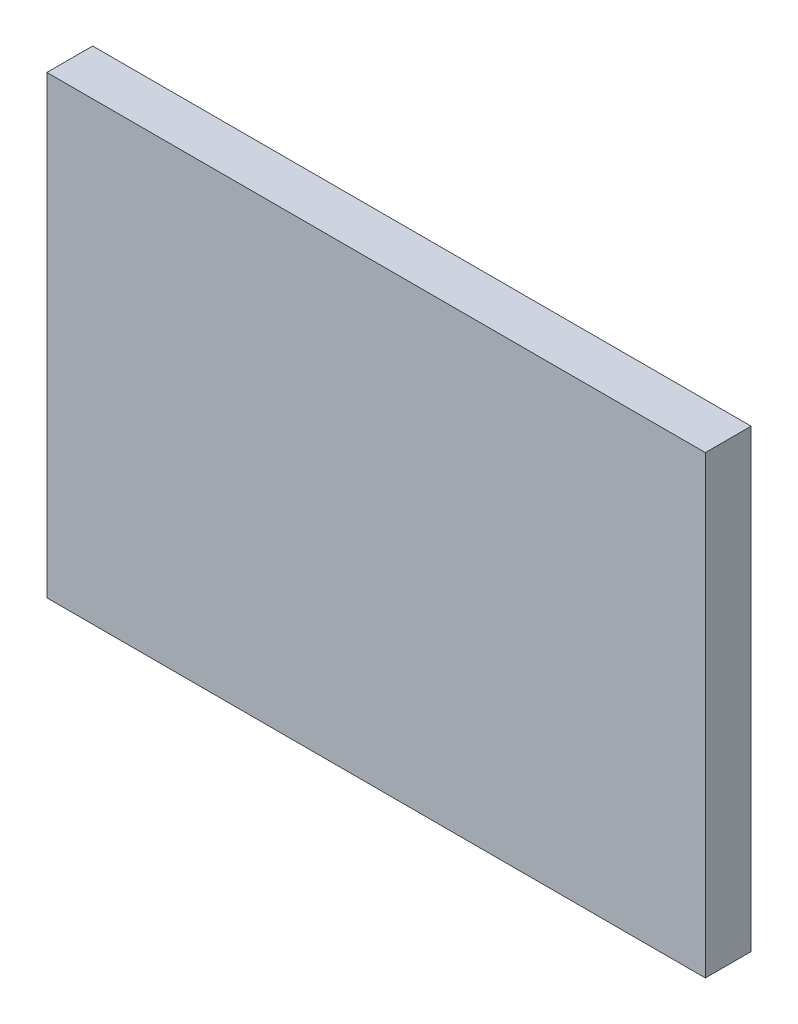
ISO-10303-21;
HEADER;
FILE_DESCRIPTION(('STEP AP214'),'2;1');
FILE_NAME('part.step','',(''),(''),'','','');
FILE_SCHEMA(('AUTOMOTIVE_DESIGN { 1 0 10303 214 1 1 1 1 }'));
ENDSEC;
DATA;
#1=APPLICATION_CONTEXT('core data for automotive mechanical design processes');
#2=APPLICATION_PROTOCOL_DEFINITION('international standard','automotive_design',2000,#1);
#3=PRODUCT_CONTEXT('',#1,'mechanical');
#4=PRODUCT('Part','Part','',(#3));
#5=PRODUCT_RELATED_PRODUCT_CATEGORY('part','',(#4));
#6=PRODUCT_DEFINITION_FORMATION('','',#4);
#7=PRODUCT_DEFINITION_CONTEXT('part definition',#1,'design');
#8=PRODUCT_DEFINITION('design','',#6,#7);
#9=PRODUCT_DEFINITION_SHAPE('','',#8);
#10=(LENGTH_UNIT() NAMED_UNIT(*) SI_UNIT(.MILLI.,.METRE.));
#11=(NAMED_UNIT(*) PLANE_ANGLE_UNIT() SI_UNIT($,.RADIAN.));
#12=(NAMED_UNIT(*) SI_UNIT($,.STERADIAN.) SOLID_ANGLE_UNIT());
#13=UNCERTAINTY_MEASURE_WITH_UNIT(LENGTH_MEASURE(1.E-05),#10,'distance_accuracy_value','');
#14=(GEOMETRIC_REPRESENTATION_CONTEXT(3) GLOBAL_UNCERTAINTY_ASSIGNED_CONTEXT((#13)) GLOBAL_UNIT_ASSIGNED_CONTEXT((#10,
#11,#12)) REPRESENTATION_CONTEXT('',''));
#15=CARTESIAN_POINT('',(0.,0.,0.));
#16=DIRECTION('',(0.,0.,1.));
#17=DIRECTION('',(1.,0.,0.));
#18=AXIS2_PLACEMENT_3D('',#15,#16,#17);
#19=CARTESIAN_POINT('',(-72.7760051825827,35.2199482441257,19.5843599301058));
#20=DIRECTION('',(1.,0.,0.));
#21=DIRECTION('',(0.,0.,-1.));
#22=AXIS2_PLACEMENT_3D('',#19,#20,#21);
#23=PLANE('',#22);
#24=DIRECTION('',(0.,-1.,0.));
#25=VECTOR('',#24,1.);
#26=CARTESIAN_POINT('',(-72.7760051825827,35.2199482441257,17.0443599301058));
#27=LINE('',#26,#25);
#28=CARTESIAN_POINT('',(-72.7760051825827,35.2199482441257,17.0443599301058));
#29=VERTEX_POINT('',#28);
#30=CARTESIAN_POINT('',(-72.7760051825827,9.98114430586372,17.0443599301058));
#31=VERTEX_POINT('',#30);
#32=EDGE_CURVE('E104',#29,#31,#27,.T.);
#33=ORIENTED_EDGE('',*,*,#32,.T.);
#34=DIRECTION('',(0.,0.,-1.));
#35=VECTOR('',#34,1.);
#36=CARTESIAN_POINT('',(-72.7760051825827,9.98114430586372,19.5843599301058));
#37=LINE('',#36,#35);
#38=CARTESIAN_POINT('',(-72.7760051825827,9.98114430586372,19.5843599301058));
#39=VERTEX_POINT('',#38);
#40=EDGE_CURVE('E11',#39,#31,#37,.T.);
#41=ORIENTED_EDGE('',*,*,#40,.F.);
#42=DIRECTION('',(0.,-1.,0.));
#43=VECTOR('',#42,1.);
#44=CARTESIAN_POINT('',(-72.7760051825827,35.2199482441257,19.5843599301058));
#45=LINE('',#44,#43);
#46=CARTESIAN_POINT('',(-72.7760051825827,35.2199482441257,19.5843599301058));
#47=VERTEX_POINT('',#46);
#48=EDGE_CURVE('E92',#47,#39,#45,.T.);
#49=ORIENTED_EDGE('',*,*,#48,.F.);
#50=DIRECTION('',(0.,0.,-1.));
#51=VECTOR('',#50,1.);
#52=CARTESIAN_POINT('',(-72.7760051825827,35.2199482441257,19.5843599301058));
#53=LINE('',#52,#51);
#54=EDGE_CURVE('E100',#47,#29,#53,.T.);
#55=ORIENTED_EDGE('',*,*,#54,.T.);
#56=EDGE_LOOP('',(#33,#41,#49,#55));
#57=FACE_BOUND('',#56,.T.);
#58=ADVANCED_FACE('F41',(#57),#23,.F.);
#59=CARTESIAN_POINT('',(-72.7760051825827,9.98114430586372,19.5843599301058));
#60=DIRECTION('',(0.,1.,0.));
#61=DIRECTION('',(0.,0.,1.));
#62=AXIS2_PLACEMENT_3D('',#59,#60,#61);
#63=PLANE('',#62);
#64=DIRECTION('',(1.,0.,0.));
#65=VECTOR('',#64,1.);
#66=CARTESIAN_POINT('',(-72.7760051825827,9.98114430586372,17.0443599301058));
#67=LINE('',#66,#65);
#68=CARTESIAN_POINT('',(-36.2515572068864,9.98114430586372,17.0443599301058));
#69=VERTEX_POINT('',#68);
#70=EDGE_CURVE('E96',#31,#69,#67,.T.);
#71=ORIENTED_EDGE('',*,*,#70,.T.);
#72=DIRECTION('',(0.,0.,-1.));
#73=VECTOR('',#72,1.);
#74=CARTESIAN_POINT('',(-36.2515572068864,9.98114430586372,19.5843599301058));
#75=LINE('',#74,#73);
#76=CARTESIAN_POINT('',(-36.2515572068864,9.98114430586372,19.5843599301058));
#77=VERTEX_POINT('',#76);
#78=EDGE_CURVE('E49',#77,#69,#75,.T.);
#79=ORIENTED_EDGE('',*,*,#78,.F.);
#80=DIRECTION('',(1.,0.,0.));
#81=VECTOR('',#80,1.);
#82=CARTESIAN_POINT('',(-72.7760051825827,9.98114430586372,19.5843599301058));
#83=LINE('',#82,#81);
#84=EDGE_CURVE('E87',#39,#77,#83,.T.);
#85=ORIENTED_EDGE('',*,*,#84,.F.);
#86=ORIENTED_EDGE('',*,*,#40,.T.);
#87=EDGE_LOOP('',(#71,#79,#85,#86));
#88=FACE_BOUND('',#87,.T.);
#89=ADVANCED_FACE('F95',(#88),#63,.F.);
#90=CARTESIAN_POINT('',(-36.2515572068864,35.2199482441257,19.5843599301058));
#91=DIRECTION('',(-1.,0.,0.));
#92=DIRECTION('',(0.,0.,1.));
#93=AXIS2_PLACEMENT_3D('',#90,#91,#92);
#94=PLANE('',#93);
#95=DIRECTION('',(0.,1.,0.));
#96=VECTOR('',#95,1.);
#97=CARTESIAN_POINT('',(-36.2515572068864,35.2199482441257,17.0443599301058));
#98=LINE('',#97,#96);
#99=CARTESIAN_POINT('',(-36.2515572068864,35.2199482441257,17.0443599301058));
#100=VERTEX_POINT('',#99);
#101=EDGE_CURVE('E74',#69,#100,#98,.T.);
#102=ORIENTED_EDGE('',*,*,#101,.T.);
#103=DIRECTION('',(0.,0.,-1.));
#104=VECTOR('',#103,1.);
#105=CARTESIAN_POINT('',(-36.2515572068864,35.2199482441257,19.5843599301058));
#106=LINE('',#105,#104);
#107=CARTESIAN_POINT('',(-36.2515572068864,35.2199482441257,19.5843599301058));
#108=VERTEX_POINT('',#107);
#109=EDGE_CURVE('E97',#108,#100,#106,.T.);
#110=ORIENTED_EDGE('',*,*,#109,.F.);
#111=DIRECTION('',(0.,1.,0.));
#112=VECTOR('',#111,1.);
#113=CARTESIAN_POINT('',(-36.2515572068864,35.2199482441257,19.5843599301058));
#114=LINE('',#113,#112);
#115=EDGE_CURVE('E90',#77,#108,#114,.T.);
#116=ORIENTED_EDGE('',*,*,#115,.F.);
#117=ORIENTED_EDGE('',*,*,#78,.T.);
#118=EDGE_LOOP('',(#102,#110,#116,#117));
#119=FACE_BOUND('',#118,.T.);
#120=ADVANCED_FACE('F98',(#119),#94,.F.);
#121=CARTESIAN_POINT('',(-72.7760051825827,35.2199482441257,19.5843599301058));
#122=DIRECTION('',(0.,-1.,0.));
#123=DIRECTION('',(0.,0.,-1.));
#124=AXIS2_PLACEMENT_3D('',#121,#122,#123);
#125=PLANE('',#124);
#126=DIRECTION('',(-1.,0.,0.));
#127=VECTOR('',#126,1.);
#128=CARTESIAN_POINT('',(-72.7760051825827,35.2199482441257,17.0443599301058));
#129=LINE('',#128,#127);
#130=EDGE_CURVE('E80',#100,#29,#129,.T.);
#131=ORIENTED_EDGE('',*,*,#130,.T.);
#132=ORIENTED_EDGE('',*,*,#54,.F.);
#133=DIRECTION('',(-1.,0.,0.));
#134=VECTOR('',#133,1.);
#135=CARTESIAN_POINT('',(-72.7760051825827,35.2199482441257,19.5843599301058));
#136=LINE('',#135,#134);
#137=EDGE_CURVE('E57',#108,#47,#136,.T.);
#138=ORIENTED_EDGE('',*,*,#137,.F.);
#139=ORIENTED_EDGE('',*,*,#109,.T.);
#140=EDGE_LOOP('',(#131,#132,#138,#139));
#141=FACE_BOUND('',#140,.T.);
#142=ADVANCED_FACE('F111',(#141),#125,.F.);
#143=CARTESIAN_POINT('',(-54.0007973748512,16.8551274923009,19.5843599301058));
#144=DIRECTION('',(0.,0.,1.));
#145=DIRECTION('',(1.,0.,0.));
#146=AXIS2_PLACEMENT_3D('',#143,#144,#145);
#147=PLANE('',#146);
#148=ORIENTED_EDGE('',*,*,#48,.T.);
#149=ORIENTED_EDGE('',*,*,#84,.T.);
#150=ORIENTED_EDGE('',*,*,#115,.T.);
#151=ORIENTED_EDGE('',*,*,#137,.T.);
#152=EDGE_LOOP('',(#148,#149,#150,#151));
#153=FACE_BOUND('',#152,.T.);
#154=ADVANCED_FACE('F88',(#153),#147,.T.);
#155=CARTESIAN_POINT('',(-54.0007973748512,16.8551274923009,17.0443599301058));
#156=DIRECTION('',(0.,0.,1.));
#157=DIRECTION('',(1.,0.,0.));
#158=AXIS2_PLACEMENT_3D('',#155,#156,#157);
#159=PLANE('',#158);
#160=ORIENTED_EDGE('',*,*,#32,.F.);
#161=ORIENTED_EDGE('',*,*,#130,.F.);
#162=ORIENTED_EDGE('',*,*,#101,.F.);
#163=ORIENTED_EDGE('',*,*,#70,.F.);
#164=EDGE_LOOP('',(#160,#161,#162,#163));
#165=FACE_BOUND('',#164,.T.);
#166=ADVANCED_FACE('F114',(#165),#159,.F.);
#167=CLOSED_SHELL('',(#58,#89,#120,#142,#154,#166));
#168=MANIFOLD_SOLID_BREP('B2',#167);
#169=ADVANCED_BREP_SHAPE_REPRESENTATION('',(#18,#168),#14);
#170=SHAPE_DEFINITION_REPRESENTATION(#9,#169);
ENDSEC;
END-ISO-10303-21;
